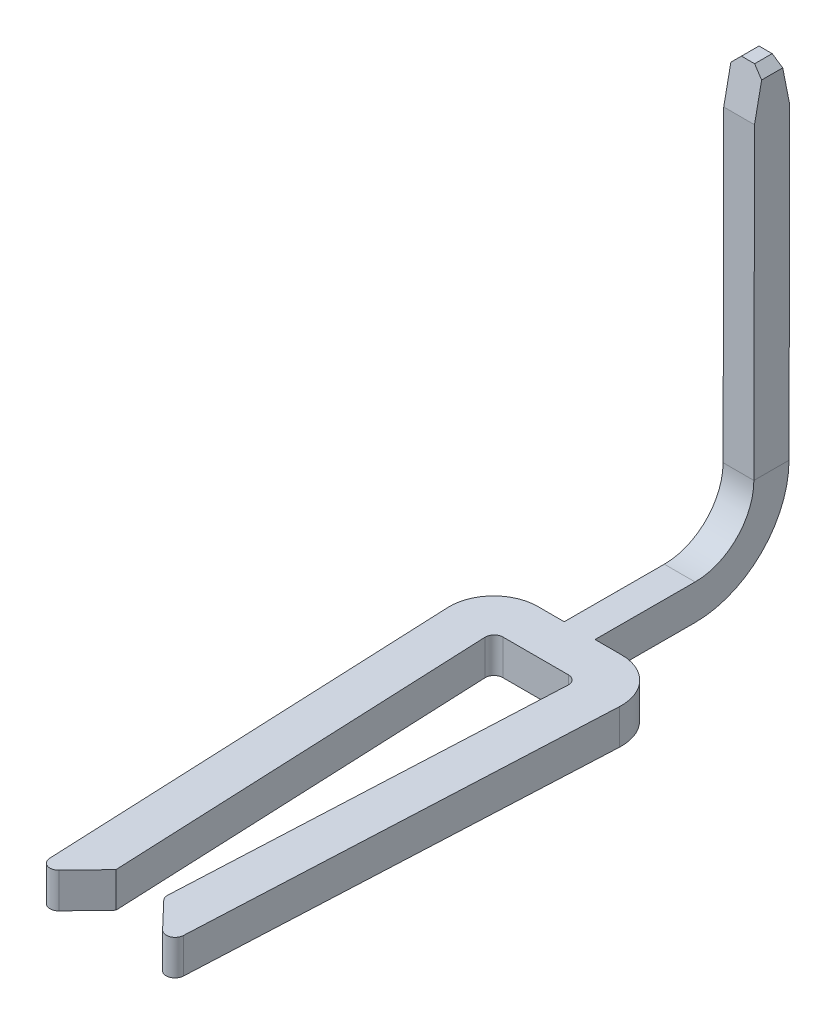
ISO-10303-21;
HEADER;
FILE_DESCRIPTION(('STEP AP214'),'2;1');
FILE_NAME('part.step','',(''),(''),'','','');
FILE_SCHEMA(('AUTOMOTIVE_DESIGN { 1 0 10303 214 1 1 1 1 }'));
ENDSEC;
DATA;
#1=APPLICATION_CONTEXT('core data for automotive mechanical design processes');
#2=APPLICATION_PROTOCOL_DEFINITION('international standard','automotive_design',2000,#1);
#3=PRODUCT_CONTEXT('',#1,'mechanical');
#4=PRODUCT('Part','Part','',(#3));
#5=PRODUCT_RELATED_PRODUCT_CATEGORY('part','',(#4));
#6=PRODUCT_DEFINITION_FORMATION('','',#4);
#7=PRODUCT_DEFINITION_CONTEXT('part definition',#1,'design');
#8=PRODUCT_DEFINITION('design','',#6,#7);
#9=PRODUCT_DEFINITION_SHAPE('','',#8);
#10=(LENGTH_UNIT() NAMED_UNIT(*) SI_UNIT(.MILLI.,.METRE.));
#11=(NAMED_UNIT(*) PLANE_ANGLE_UNIT() SI_UNIT($,.RADIAN.));
#12=(NAMED_UNIT(*) SI_UNIT($,.STERADIAN.) SOLID_ANGLE_UNIT());
#13=UNCERTAINTY_MEASURE_WITH_UNIT(LENGTH_MEASURE(1.E-05),#10,'distance_accuracy_value','');
#14=(GEOMETRIC_REPRESENTATION_CONTEXT(3) GLOBAL_UNCERTAINTY_ASSIGNED_CONTEXT((#13)) GLOBAL_UNIT_ASSIGNED_CONTEXT((#10,
#11,#12)) REPRESENTATION_CONTEXT('',''));
#15=CARTESIAN_POINT('',(0.,0.,0.));
#16=DIRECTION('',(0.,0.,1.));
#17=DIRECTION('',(1.,0.,0.));
#18=AXIS2_PLACEMENT_3D('',#15,#16,#17);
#19=CARTESIAN_POINT('',(-1.463462188596E-05,4.865130922687,-1.715381004673));
#20=DIRECTION('',(-3.25642428491655E-06,0.999997785371169,-0.00210457647840936));
#21=DIRECTION('',(0.,0.00210457647842051,0.999997785376471));
#22=AXIS2_PLACEMENT_3D('',#19,#20,#21);
#23=PLANE('',#22);
#24=DIRECTION('',(0.99999999999672,-4.97020864438725E-07,2.5125900913821E-06));
#25=VECTOR('',#24,1.);
#26=CARTESIAN_POINT('',(-1.430829339538E-05,4.86492018301854,-1.81538083899727));
#27=LINE('',#26,#25);
#28=CARTESIAN_POINT('',(-0.0750141137719823,4.86492025919893,-1.81538102752295));
#29=VERTEX_POINT('',#28);
#30=CARTESIAN_POINT('',(0.0749860891615574,4.86492033367762,-1.81538065094792));
#31=VERTEX_POINT('',#30);
#32=EDGE_CURVE('E187',#29,#31,#27,.T.);
#33=ORIENTED_EDGE('',*,*,#32,.F.);
#34=DIRECTION('',(-3.84684707323419E-06,0.00210399290310039,0.999997786597083));
#35=VECTOR('',#34,1.);
#36=CARTESIAN_POINT('',(-0.0750141915805268,4.8649203370068,-1.81538102768701));
#37=LINE('',#36,#35);
#38=CARTESIAN_POINT('',(-0.0750149609494172,4.86534114613673,-1.61538158476463));
#39=VERTEX_POINT('',#38);
#40=EDGE_CURVE('E193',#29,#39,#37,.T.);
#41=ORIENTED_EDGE('',*,*,#40,.T.);
#42=DIRECTION('',(0.999999999992633,7.60721855878868E-07,3.76241672235724E-06));
#43=VECTOR('',#42,1.);
#44=CARTESIAN_POINT('',(-1.496095037655E-05,4.86534122499781,-1.61538119472863));
#45=LINE('',#44,#43);
#46=CARTESIAN_POINT('',(0.0749850053672122,4.86534150321436,-1.61538094948013));
#47=VERTEX_POINT('',#46);
#48=EDGE_CURVE('E228',#39,#47,#45,.T.);
#49=ORIENTED_EDGE('',*,*,#48,.T.);
#50=DIRECTION('',(3.84685069306866E-06,-0.00210516002847208,-0.999997784140773));
#51=VECTOR('',#50,1.);
#52=CARTESIAN_POINT('',(0.0749849223360024,4.86534174179257,-1.61538098215025));
#53=LINE('',#52,#51);
#54=EDGE_CURVE('E207',#47,#31,#53,.T.);
#55=ORIENTED_EDGE('',*,*,#54,.T.);
#56=EDGE_LOOP('',(#33,#41,#49,#55));
#57=FACE_BOUND('',#56,.T.);
#58=ADVANCED_FACE('F17',(#57),#23,.T.);
#59=CARTESIAN_POINT('',(0.07498536537731,4.865131167434,-1.715380760441));
#60=DIRECTION('',(-0.707104478539354,-0.707107522698354,0.00148585765971474));
#61=DIRECTION('',(0.707108303266089,-0.707105259103729,0.));
#62=AXIS2_PLACEMENT_3D('',#59,#60,#61);
#63=PLANE('',#62);
#64=DIRECTION('',(0.70014281484191,-0.699840594134196,0.14150329193041));
#65=VECTOR('',#64,1.);
#66=CARTESIAN_POINT('',(0.07498480562393,4.86534162508,-1.61538098190502));
#67=LINE('',#66,#65);
#68=CARTESIAN_POINT('',(0.174985299424559,4.76538428606289,-1.59517030396589));
#69=VERTEX_POINT('',#68);
#70=EDGE_CURVE('E233',#47,#69,#67,.T.);
#71=ORIENTED_EDGE('',*,*,#70,.T.);
#72=DIRECTION('',(-3.26328490597479E-06,0.00210457646545854,0.999997785371174));
#73=VECTOR('',#72,1.);
#74=CARTESIAN_POINT('',(0.17498608261278,4.764879166049,-1.835169711395));
#75=LINE('',#74,#73);
#76=CARTESIAN_POINT('',(0.174986082612927,4.76487916604903,-1.83516971139521));
#77=VERTEX_POINT('',#76);
#78=EDGE_CURVE('E217',#77,#69,#75,.T.);
#79=ORIENTED_EDGE('',*,*,#78,.F.);
#80=DIRECTION('',(0.700142663372175,-0.700431017500769,-0.138551942061291));
#81=VECTOR('',#80,1.);
#82=CARTESIAN_POINT('',(0.0749856917056828,4.86492074217058,-1.81538053257219));
#83=LINE('',#82,#81);
#84=EDGE_CURVE('E209',#31,#77,#83,.T.);
#85=ORIENTED_EDGE('',*,*,#84,.F.);
#86=ORIENTED_EDGE('',*,*,#54,.F.);
#87=EDGE_LOOP('',(#71,#79,#85,#86));
#88=FACE_BOUND('',#87,.T.);
#89=ADVANCED_FACE('F629',(#88),#63,.F.);
#90=CARTESIAN_POINT('',(0.175007184791,-1.635275026444,-1.901700244763));
#91=DIRECTION('',(0.999999999989374,3.26328490643622E-06,3.25642428496622E-06));
#92=DIRECTION('',(-3.26328490645352E-06,0.999999999994675,0.));
#93=AXIS2_PLACEMENT_3D('',#90,#91,#92);
#94=PLANE('',#93);
#95=ORIENTED_EDGE('',*,*,#78,.T.);
#96=DIRECTION('',(0.,0.980165762670786,-0.198179407830372));
#97=VECTOR('',#96,1.);
#98=CARTESIAN_POINT('',(0.17498529942436,4.86534151346052,-1.61538056771209));
#99=LINE('',#98,#97);
#100=CARTESIAN_POINT('',(0.174985646593566,4.36555335615953,-1.51432856778294));
#101=VERTEX_POINT('',#100);
#102=EDGE_CURVE('E236',#69,#101,#99,.F.);
#103=ORIENTED_EDGE('',*,*,#102,.T.);
#104=DIRECTION('',(-3.49443103478557E-06,0.999997785370364,-0.00210457647918396));
#105=VECTOR('',#104,1.);
#106=CARTESIAN_POINT('',(0.174998571439184,0.865561512268137,-1.5069625723225));
#107=LINE('',#106,#105);
#108=CARTESIAN_POINT('',(0.174999960433436,0.865561368804181,-1.50696257201619));
#109=VERTEX_POINT('',#108);
#110=EDGE_CURVE('E237',#109,#101,#107,.T.);
#111=ORIENTED_EDGE('',*,*,#110,.F.);
#112=DIRECTION('',(3.26328805578984E-06,-0.00210554377478037,-0.999997783334925));
#113=VECTOR('',#112,1.);
#114=CARTESIAN_POINT('',(0.174997738416343,0.865561511739281,-1.50696282232171));
#115=LINE('',#114,#113);
#116=CARTESIAN_POINT('',(0.175001265747852,0.864719102488243,-1.90696168524787));
#117=VERTEX_POINT('',#116);
#118=EDGE_CURVE('E220',#109,#117,#115,.T.);
#119=ORIENTED_EDGE('',*,*,#118,.T.);
#120=DIRECTION('',(-3.9389050821038E-06,0.999997785368709,-0.00210457648063097));
#121=VECTOR('',#120,1.);
#122=CARTESIAN_POINT('',(0.175001265746,0.864719294762998,-1.90696168565267));
#123=LINE('',#122,#121);
#124=CARTESIAN_POINT('',(0.174987013925,4.36471084672889,-1.9143277563463));
#125=VERTEX_POINT('',#124);
#126=EDGE_CURVE('E331',#117,#125,#123,.T.);
#127=ORIENTED_EDGE('',*,*,#126,.T.);
#128=DIRECTION('',(0.,0.980991245476944,0.194051993799582));
#129=VECTOR('',#128,1.);
#130=CARTESIAN_POINT('',(0.174986082613,4.86492037806116,-1.81538034350575));
#131=LINE('',#130,#129);
#132=EDGE_CURVE('E204',#77,#125,#131,.F.);
#133=ORIENTED_EDGE('',*,*,#132,.F.);
#134=EDGE_LOOP('',(#95,#103,#111,#119,#127,#133));
#135=FACE_BOUND('',#134,.T.);
#136=ADVANCED_FACE('F362',(#135),#94,.T.);
#137=CARTESIAN_POINT('',(-0.660699790075,-6.89625102089,-1.490629935269));
#138=DIRECTION('',(-3.26328490585055E-06,0.00210457646778236,0.999997785371169));
#139=DIRECTION('',(0.,-0.999997785376493,0.00210457646779356));
#140=AXIS2_PLACEMENT_3D('',#137,#138,#139);
#141=PLANE('',#140);
#142=DIRECTION('',(0.999999999994675,6.867832620559E-09,3.26327767890309E-06));
#143=VECTOR('',#142,1.);
#144=CARTESIAN_POINT('',(-0.660699790075,0.865560932680311,-1.5069652982306));
#145=LINE('',#144,#143);
#146=CARTESIAN_POINT('',(-0.175002261582777,0.865560938618676,-1.5069637132704));
#147=VERTEX_POINT('',#146);
#148=EDGE_CURVE('E219',#147,#109,#145,.T.);
#149=ORIENTED_EDGE('',*,*,#148,.T.);
#150=ORIENTED_EDGE('',*,*,#110,.T.);
#151=DIRECTION('',(0.999999999992633,7.60721855878868E-07,3.76241672235724E-06));
#152=VECTOR('',#151,1.);
#153=CARTESIAN_POINT('',(-1.496095037655E-05,4.36555322305428,-1.51432921552461));
#154=LINE('',#153,#152);
#155=CARTESIAN_POINT('',(-0.175016815444694,4.36555261278008,-1.51432977748102));
#156=VERTEX_POINT('',#155);
#157=EDGE_CURVE('E230',#101,#156,#154,.F.);
#158=ORIENTED_EDGE('',*,*,#157,.T.);
#159=DIRECTION('',(-4.1582472281534E-06,0.999997785367819,-0.00210457648149677));
#160=VECTOR('',#159,1.);
#161=CARTESIAN_POINT('',(-0.175002261582766,0.865560936016,-1.506963713265));
#162=LINE('',#161,#160);
#163=EDGE_CURVE('E323',#147,#156,#162,.T.);
#164=ORIENTED_EDGE('',*,*,#163,.F.);
#165=EDGE_LOOP('',(#149,#150,#158,#164));
#166=FACE_BOUND('',#165,.T.);
#167=ADVANCED_FACE('F635',(#166),#141,.T.);
#168=CARTESIAN_POINT('',(-1.496095037655E-05,4.865341380334,-1.615381226136));
#169=DIRECTION('',(3.8385514630763E-06,-0.198179407828912,-0.980165762663565));
#170=DIRECTION('',(0.,0.980165762670786,-0.198179407830372));
#171=AXIS2_PLACEMENT_3D('',#168,#169,#170);
#172=PLANE('',#171);
#173=DIRECTION('',(-0.700138103468634,-0.699845958596594,0.141500071757432));
#174=VECTOR('',#173,1.);
#175=CARTESIAN_POINT('',(-0.075014960949294,4.86534113523326,-1.615381638692));
#176=LINE('',#175,#174);
#177=CARTESIAN_POINT('',(-0.175017620001244,4.76538254779124,-1.59517126651604));
#178=VERTEX_POINT('',#177);
#179=EDGE_CURVE('E197',#39,#178,#176,.T.);
#180=ORIENTED_EDGE('',*,*,#179,.T.);
#181=DIRECTION('',(-3.43751459112234E-06,0.980165762662443,-0.19817940784182));
#182=VECTOR('',#181,1.);
#183=CARTESIAN_POINT('',(-0.175016815444694,4.36555237420685,-1.51432972924427));
#184=LINE('',#183,#182);
#185=EDGE_CURVE('E165',#156,#178,#184,.T.);
#186=ORIENTED_EDGE('',*,*,#185,.F.);
#187=ORIENTED_EDGE('',*,*,#157,.F.);
#188=ORIENTED_EDGE('',*,*,#102,.F.);
#189=ORIENTED_EDGE('',*,*,#70,.F.);
#190=ORIENTED_EDGE('',*,*,#48,.F.);
#191=EDGE_LOOP('',(#180,#186,#187,#188,#189,#190));
#192=FACE_BOUND('',#191,.T.);
#193=ADVANCED_FACE('F628',(#192),#172,.F.);
#194=CARTESIAN_POINT('',(-0.07501463462109,4.865130677941,-1.715381248905));
#195=DIRECTION('',(0.707109083818663,-0.707102907716663,0.00149046293910229));
#196=DIRECTION('',(0.707103693125374,0.707109869234235,0.));
#197=AXIS2_PLACEMENT_3D('',#194,#195,#196);
#198=PLANE('',#197);
#199=DIRECTION('',(0.700138254945022,0.700434562183973,0.138556299245773));
#200=VECTOR('',#199,1.);
#201=CARTESIAN_POINT('',(-0.175013917383573,4.76487805659896,-1.83517084467532));
#202=LINE('',#201,#200);
#203=CARTESIAN_POINT('',(-0.175017434485298,4.76487627304445,-1.8351710700712));
#204=VERTEX_POINT('',#203);
#205=EDGE_CURVE('E195',#204,#29,#202,.T.);
#206=ORIENTED_EDGE('',*,*,#205,.F.);
#207=DIRECTION('',(3.26328216226373E-06,-0.00210457646545854,-0.999997785371174));
#208=VECTOR('',#207,1.);
#209=CARTESIAN_POINT('',(-0.175018217681012,4.76538312223635,-1.59517138266645));
#210=LINE('',#209,#208);
#211=EDGE_CURVE('E159',#178,#204,#210,.T.);
#212=ORIENTED_EDGE('',*,*,#211,.F.);
#213=ORIENTED_EDGE('',*,*,#179,.F.);
#214=ORIENTED_EDGE('',*,*,#40,.F.);
#215=EDGE_LOOP('',(#206,#212,#213,#214));
#216=FACE_BOUND('',#215,.T.);
#217=ADVANCED_FACE('F194',(#216),#198,.F.);
#218=CARTESIAN_POINT('',(-1.430829339538E-05,4.86492046504,-1.81538078321));
#219=DIRECTION('',(2.56127677282229E-06,0.194051993798946,-0.980991245473727));
#220=DIRECTION('',(0.,0.980991245476944,0.194051993799582));
#221=AXIS2_PLACEMENT_3D('',#218,#219,#220);
#222=PLANE('',#221);
#223=DIRECTION('',(-4.71748013645017E-06,0.980991166183589,0.194052394593592));
#224=VECTOR('',#223,1.);
#225=CARTESIAN_POINT('',(-0.175015510131829,4.36471054361986,-1.91432884339227));
#226=LINE('',#225,#224);
#227=CARTESIAN_POINT('',(-0.175015510132432,4.36471068858205,-1.9143288436974));
#228=VERTEX_POINT('',#227);
#229=EDGE_CURVE('E20',#204,#228,#226,.F.);
#230=ORIENTED_EDGE('',*,*,#229,.F.);
#231=ORIENTED_EDGE('',*,*,#205,.T.);
#232=ORIENTED_EDGE('',*,*,#32,.T.);
#233=ORIENTED_EDGE('',*,*,#84,.T.);
#234=ORIENTED_EDGE('',*,*,#132,.T.);
#235=DIRECTION('',(0.999999999994675,6.867832620559E-09,3.26327767890309E-06));
#236=VECTOR('',#235,1.);
#237=CARTESIAN_POINT('',(-0.660698484761,4.36471083020865,-1.91433042892102));
#238=LINE('',#237,#236);
#239=EDGE_CURVE('E329',#125,#228,#238,.F.);
#240=ORIENTED_EDGE('',*,*,#239,.T.);
#241=EDGE_LOOP('',(#230,#231,#232,#233,#234,#240));
#242=FACE_BOUND('',#241,.T.);
#243=ADVANCED_FACE('F201',(#242),#222,.T.);
#244=CARTESIAN_POINT('',(-0.660698484761,-6.897092851477,-1.890629049418));
#245=DIRECTION('',(-3.26328490585055E-06,0.00210457646778236,0.999997785371169));
#246=DIRECTION('',(0.,-0.999997785376493,0.00210457646779356));
#247=AXIS2_PLACEMENT_3D('',#244,#245,#246);
#248=PLANE('',#247);
#249=ORIENTED_EDGE('',*,*,#126,.F.);
#250=DIRECTION('',(0.999999999994675,6.867832620559E-09,3.26327767890309E-06));
#251=VECTOR('',#250,1.);
#252=CARTESIAN_POINT('',(-0.660698484761,0.864718904481308,-1.90696441196371));
#253=LINE('',#252,#251);
#254=CARTESIAN_POINT('',(-0.175000956269501,0.864719009225572,-1.90696282721062));
#255=VERTEX_POINT('',#254);
#256=EDGE_CURVE('E203',#255,#117,#253,.T.);
#257=ORIENTED_EDGE('',*,*,#256,.F.);
#258=DIRECTION('',(4.15824722815211E-06,-0.999997785367819,0.0021045764815281));
#259=VECTOR('',#258,1.);
#260=CARTESIAN_POINT('',(-0.175015510131829,4.36471054361985,-1.91432884339227));
#261=LINE('',#260,#259);
#262=EDGE_CURVE('E311',#228,#255,#261,.T.);
#263=ORIENTED_EDGE('',*,*,#262,.F.);
#264=ORIENTED_EDGE('',*,*,#239,.F.);
#265=EDGE_LOOP('',(#249,#257,#263,#264));
#266=FACE_BOUND('',#265,.T.);
#267=ADVANCED_FACE('F374',(#266),#248,.F.);
#268=CARTESIAN_POINT('',(-0.175000956267,0.864718407818,-1.906962825945));
#269=DIRECTION('',(-0.99999999998603,-4.16510584607213E-06,-3.2545235860591E-06));
#270=DIRECTION('',(4.16510584609418E-06,-0.999999999991326,0.));
#271=AXIS2_PLACEMENT_3D('',#268,#269,#270);
#272=PLANE('',#271);
#273=ORIENTED_EDGE('',*,*,#229,.T.);
#274=ORIENTED_EDGE('',*,*,#262,.T.);
#275=CARTESIAN_POINT('',(-0.175004438076532,0.866964619264,-0.840000571091002));
#276=DIRECTION('',(-0.99999999998603,-4.16510584607213E-06,-3.2545235860591E-06));
#277=DIRECTION('',(4.16510584609418E-06,-0.999999999991326,0.));
#278=AXIS2_PLACEMENT_3D('',#275,#276,#277);
#279=CIRCLE('',#278,1.066964619264);
#280=CARTESIAN_POINT('',(-0.175001112382431,-0.199997636538759,-0.837754812458445));
#281=VERTEX_POINT('',#280);
#282=EDGE_CURVE('E309',#281,#255,#279,.F.);
#283=ORIENTED_EDGE('',*,*,#282,.F.);
#284=DIRECTION('',(-4.15824723002358E-06,0.999997785369037,-0.00210457590274754));
#285=VECTOR('',#284,1.);
#286=CARTESIAN_POINT('',(-0.175000001375724,-0.199997635864746,-0.837754491631768));
#287=LINE('',#286,#285);
#288=CARTESIAN_POINT('',(-0.175000831649492,0.200001291003723,-0.838596215389816));
#289=VERTEX_POINT('',#288);
#290=EDGE_CURVE('E325',#281,#289,#287,.T.);
#291=ORIENTED_EDGE('',*,*,#290,.T.);
#292=CARTESIAN_POINT('',(-0.175004438076532,0.866964619264,-0.840000571091002));
#293=DIRECTION('',(-0.99999999998603,-4.16510584607213E-06,-3.2545235860591E-06));
#294=DIRECTION('',(4.16510584609418E-06,-0.999999999991326,0.));
#295=AXIS2_PLACEMENT_3D('',#292,#293,#294);
#296=CIRCLE('',#295,0.666964619264);
#297=EDGE_CURVE('E306',#289,#147,#296,.F.);
#298=ORIENTED_EDGE('',*,*,#297,.T.);
#299=ORIENTED_EDGE('',*,*,#163,.T.);
#300=ORIENTED_EDGE('',*,*,#185,.T.);
#301=ORIENTED_EDGE('',*,*,#211,.T.);
#302=EDGE_LOOP('',(#273,#274,#283,#291,#298,#299,#300,#301));
#303=FACE_BOUND('',#302,.T.);
#304=ADVANCED_FACE('F378',(#303),#272,.T.);
#305=CARTESIAN_POINT('',(-0.175004437551,0.866964619264,-0.840000571091));
#306=DIRECTION('',(0.999999999994676,0.,3.26329213278794E-06));
#307=DIRECTION('',(3.26329213278794E-06,0.,-0.999999999994676));
#308=AXIS2_PLACEMENT_3D('',#305,#306,#307);
#309=CYLINDRICAL_SURFACE('',#308,1.066964619264);
#310=CARTESIAN_POINT('',(0.175000005953661,0.866964619264,-0.839999428924253));
#311=DIRECTION('',(0.999999999999593,-8.76572615124842E-09,-9.01817128790833E-07));
#312=DIRECTION('',(-9.01817128790833E-07,0.,-0.999999999999594));
#313=AXIS2_PLACEMENT_3D('',#310,#311,#312);
#314=CIRCLE('',#313,1.066964619264);
#315=CARTESIAN_POINT('',(0.1750000819635,-0.199997636548618,-0.837753670295029));
#316=VERTEX_POINT('',#315);
#317=EDGE_CURVE('E283',#316,#117,#314,.T.);
#318=ORIENTED_EDGE('',*,*,#317,.F.);
#319=DIRECTION('',(0.999999999994676,0.,3.26329213278794E-06));
#320=VECTOR('',#319,1.);
#321=CARTESIAN_POINT('',(-0.175004444880382,-0.199997636022669,-0.837754562462747));
#322=LINE('',#321,#320);
#323=EDGE_CURVE('E308',#316,#281,#322,.F.);
#324=ORIENTED_EDGE('',*,*,#323,.T.);
#325=ORIENTED_EDGE('',*,*,#282,.T.);
#326=ORIENTED_EDGE('',*,*,#256,.T.);
#327=EDGE_LOOP('',(#318,#324,#325,#326));
#328=FACE_BOUND('',#327,.T.);
#329=ADVANCED_FACE('F375',(#328),#309,.T.);
#330=CARTESIAN_POINT('',(-0.175004437551,0.866964619264,-0.840000571091));
#331=DIRECTION('',(0.999999999994676,0.,3.26329213278794E-06));
#332=DIRECTION('',(3.26329213278794E-06,0.,-0.999999999994676));
#333=AXIS2_PLACEMENT_3D('',#330,#331,#332);
#334=CYLINDRICAL_SURFACE('',#333,0.666964619264);
#335=DIRECTION('',(1.,-6.86783262048414E-09,1.44539109276665E-11));
#336=VECTOR('',#335,1.);
#337=CARTESIAN_POINT('',(-0.660722802882,0.200001482953957,-0.838595685024081));
#338=LINE('',#337,#336);
#339=CARTESIAN_POINT('',(0.175000001373135,0.200001477144774,-0.838595717946777));
#340=VERTEX_POINT('',#339);
#341=EDGE_CURVE('E305',#340,#289,#338,.F.);
#342=ORIENTED_EDGE('',*,*,#341,.F.);
#343=CARTESIAN_POINT('',(0.175000005953661,0.866964619264,-0.839999428924253));
#344=DIRECTION('',(0.999999999999593,-8.76572615124842E-09,-9.01817128790833E-07));
#345=DIRECTION('',(-9.01817128790833E-07,0.,-0.999999999999594));
#346=AXIS2_PLACEMENT_3D('',#343,#344,#345);
#347=CIRCLE('',#346,0.666964619264);
#348=EDGE_CURVE('E280',#109,#340,#347,.F.);
#349=ORIENTED_EDGE('',*,*,#348,.F.);
#350=ORIENTED_EDGE('',*,*,#148,.F.);
#351=ORIENTED_EDGE('',*,*,#297,.F.);
#352=EDGE_LOOP('',(#342,#349,#350,#351));
#353=FACE_BOUND('',#352,.T.);
#354=ADVANCED_FACE('F377',(#353),#334,.F.);
#355=CARTESIAN_POINT('',(-0.660722802882,0.213470775545,5.561391660584));
#356=DIRECTION('',(6.86784783018139E-09,0.999997785376493,-0.00210457646777604));
#357=DIRECTION('',(0.,0.00210457646777604,0.999997785376493));
#358=AXIS2_PLACEMENT_3D('',#355,#356,#357);
#359=PLANE('',#358);
#360=DIRECTION('',(-0.690866245713119,0.00152157689847403,0.722980992376703));
#361=VECTOR('',#360,1.);
#362=CARTESIAN_POINT('',(-0.272211008901727,0.212919738458001,5.29956548953126));
#363=LINE('',#362,#361);
#364=CARTESIAN_POINT('',(-0.272211008901909,0.212919738458,5.29956548953109));
#365=VERTEX_POINT('',#364);
#366=CARTESIAN_POINT('',(-0.588424543538575,0.213616173132981,5.63047813216401));
#367=VERTEX_POINT('',#366);
#368=EDGE_CURVE('E273',#365,#367,#363,.T.);
#369=ORIENTED_EDGE('',*,*,#368,.F.);
#370=DIRECTION('',(-0.0454076609344932,-0.00210240536982446,-0.998966327871024));
#371=VECTOR('',#370,1.);
#372=CARTESIAN_POINT('',(-0.272211008902,0.212919738458,5.299565489531));
#373=LINE('',#372,#371);
#374=CARTESIAN_POINT('',(-0.47200460483291,0.20366916002481,0.904116114866381));
#375=VERTEX_POINT('',#374);
#376=EDGE_CURVE('E474',#365,#375,#373,.T.);
#377=ORIENTED_EDGE('',*,*,#376,.T.);
#378=CARTESIAN_POINT('',(-0.372107756489,0.203659602686469,0.899575233959999));
#379=DIRECTION('',(6.86784783018139E-09,0.999997785376493,-0.00210457646777604));
#380=DIRECTION('',(0.,0.00210457646777604,0.999997785376493));
#381=AXIS2_PLACEMENT_3D('',#378,#379,#380);
#382=CIRCLE('',#381,0.09999999999845);
#383=CARTESIAN_POINT('',(-0.372107756490584,0.203449145039347,0.799575455423793));
#384=VERTEX_POINT('',#383);
#385=EDGE_CURVE('E303',#375,#384,#382,.F.);
#386=ORIENTED_EDGE('',*,*,#385,.T.);
#387=DIRECTION('',(1.,0.,-7.22694751364327E-12));
#388=VECTOR('',#387,1.);
#389=CARTESIAN_POINT('',(-0.476756463515,0.203449145039001,0.799575455424513));
#390=LINE('',#389,#388);
#391=CARTESIAN_POINT('',(0.372107634189486,0.203449142483482,0.799575455418398));
#392=VERTEX_POINT('',#391);
#393=EDGE_CURVE('E302',#384,#392,#390,.T.);
#394=ORIENTED_EDGE('',*,*,#393,.T.);
#395=CARTESIAN_POINT('',(0.372107759191,0.203659597574772,0.899575233965));
#396=DIRECTION('',(6.86784783018139E-09,0.999997785376493,-0.00210457646777604));
#397=DIRECTION('',(0.,0.00210457646777604,0.999997785376493));
#398=AXIS2_PLACEMENT_3D('',#395,#396,#397);
#399=CIRCLE('',#398,0.09999999999845);
#400=CARTESIAN_POINT('',(0.472004613210557,0.203669153278078,0.904115990000817));
#401=VERTEX_POINT('',#400);
#402=EDGE_CURVE('E299',#392,#401,#399,.F.);
#403=ORIENTED_EDGE('',*,*,#402,.T.);
#404=DIRECTION('',(-0.0454076609032243,0.00210240599378526,0.998966327871133));
#405=VECTOR('',#404,1.);
#406=CARTESIAN_POINT('',(0.472004613210548,0.203669153278,0.904115990001025));
#407=LINE('',#406,#405);
#408=CARTESIAN_POINT('',(0.274152572322218,0.21282983912638,5.25685125134316));
#409=VERTEX_POINT('',#408);
#410=EDGE_CURVE('E298',#401,#409,#407,.T.);
#411=ORIENTED_EDGE('',*,*,#410,.T.);
#412=CARTESIAN_POINT('',(0.374049411904139,0.212839395498145,5.26139232499489));
#413=DIRECTION('',(6.86784783018139E-09,0.999997785376493,-0.00210457646777604));
#414=DIRECTION('',(0.,0.00210457646777604,0.999997785376493));
#415=AXIS2_PLACEMENT_3D('',#412,#413,#414);
#416=CIRCLE('',#415,0.09999999999845);
#417=CARTESIAN_POINT('',(0.301751152558919,0.212984794079,5.33047879656981));
#418=VERTEX_POINT('',#417);
#419=EDGE_CURVE('E295',#418,#409,#416,.F.);
#420=ORIENTED_EDGE('',*,*,#419,.F.);
#421=DIRECTION('',(-0.690866245774943,-0.00152156740611231,-0.722980992337603));
#422=VECTOR('',#421,1.);
#423=CARTESIAN_POINT('',(0.588424358527808,0.213616164636,5.63047793561518));
#424=LINE('',#423,#422);
#425=CARTESIAN_POINT('',(0.588424452450644,0.213616164843221,5.63047803390358));
#426=VERTEX_POINT('',#425);
#427=EDGE_CURVE('E530',#426,#418,#424,.T.);
#428=ORIENTED_EDGE('',*,*,#427,.F.);
#429=CARTESIAN_POINT('',(0.660722805719139,0.21347076646956,5.56139166061689));
#430=DIRECTION('',(6.86784783018139E-09,0.999997785376493,-0.00210457646777604));
#431=DIRECTION('',(0.,0.00210457646777604,0.999997785376493));
#432=AXIS2_PLACEMENT_3D('',#429,#430,#431);
#433=CIRCLE('',#432,0.09999999999964);
#434=CARTESIAN_POINT('',(0.76061965973958,0.213480322172973,5.5659324166662));
#435=VERTEX_POINT('',#434);
#436=EDGE_CURVE('E291',#435,#426,#433,.F.);
#437=ORIENTED_EDGE('',*,*,#436,.F.);
#438=DIRECTION('',(-0.0454076609115571,0.00210240599372779,0.998966327870754));
#439=VECTOR('',#438,1.);
#440=CARTESIAN_POINT('',(0.976240720663177,0.203496918453,0.822279581036008));
#441=LINE('',#440,#439);
#442=CARTESIAN_POINT('',(0.976240728513844,0.203496918089409,0.822279408319732));
#443=VERTEX_POINT('',#442);
#444=EDGE_CURVE('E293',#443,#435,#441,.T.);
#445=ORIENTED_EDGE('',*,*,#444,.F.);
#446=CARTESIAN_POINT('',(0.476756466259139,0.203449139208887,0.799575455420891));
#447=DIRECTION('',(6.86784783018139E-09,0.999997785376493,-0.00210457646777604));
#448=DIRECTION('',(0.,0.00210457646777604,0.999997785376493));
#449=AXIS2_PLACEMENT_3D('',#446,#447,#448);
#450=CIRCLE('',#449,0.5);
#451=CARTESIAN_POINT('',(0.476756466381,0.202396852011497,0.299576562730695));
#452=VERTEX_POINT('',#451);
#453=EDGE_CURVE('E287',#452,#443,#450,.F.);
#454=ORIENTED_EDGE('',*,*,#453,.F.);
#455=DIRECTION('',(1.,0.,-7.22806456795341E-12));
#456=VECTOR('',#455,1.);
#457=CARTESIAN_POINT('',(0.999999998635,0.202396853047987,0.299576562724964));
#458=LINE('',#457,#456);
#459=CARTESIAN_POINT('',(0.175001027817391,0.202396853047995,0.299576562730459));
#460=VERTEX_POINT('',#459);
#461=EDGE_CURVE('E523',#460,#452,#458,.T.);
#462=ORIENTED_EDGE('',*,*,#461,.F.);
#463=DIRECTION('',(9.01833579741016E-07,0.00210457646800604,0.999997785376086));
#464=VECTOR('',#463,1.);
#465=CARTESIAN_POINT('',(0.175000001373165,0.200001477214,-0.838595685012));
#466=LINE('',#465,#464);
#467=EDGE_CURVE('E282',#340,#460,#466,.T.);
#468=ORIENTED_EDGE('',*,*,#467,.F.);
#469=ORIENTED_EDGE('',*,*,#341,.T.);
#470=DIRECTION('',(-7.22867183483043E-12,-0.00210479611450715,-0.999997784914205));
#471=VECTOR('',#470,1.);
#472=CARTESIAN_POINT('',(-0.174999998618566,0.202396855101,0.299576396062));
#473=LINE('',#472,#471);
#474=CARTESIAN_POINT('',(-0.174999998618189,0.202396856833263,0.299576562724982));
#475=VERTEX_POINT('',#474);
#476=EDGE_CURVE('E519',#475,#289,#473,.T.);
#477=ORIENTED_EDGE('',*,*,#476,.F.);
#478=DIRECTION('',(1.,0.,-7.22694751364327E-12));
#479=VECTOR('',#478,1.);
#480=CARTESIAN_POINT('',(-0.175000001365,0.202396857523995,0.299576562723528));
#481=LINE('',#480,#479);
#482=CARTESIAN_POINT('',(-0.4767561669705,0.202396857523838,0.299576562725736));
#483=VERTEX_POINT('',#482);
#484=EDGE_CURVE('E502',#483,#475,#481,.T.);
#485=ORIENTED_EDGE('',*,*,#484,.F.);
#486=CARTESIAN_POINT('',(-0.476756463488861,0.203449145757566,0.79957545541389));
#487=DIRECTION('',(6.86784783018139E-09,0.999997785376493,-0.00210457646777604));
#488=DIRECTION('',(0.,0.00210457646777604,0.999997785376493));
#489=AXIS2_PLACEMENT_3D('',#486,#487,#488);
#490=CIRCLE('',#489,0.5);
#491=CARTESIAN_POINT('',(-0.976240733596348,0.203496931135131,0.822279235527081));
#492=VERTEX_POINT('',#491);
#493=EDGE_CURVE('E275',#492,#483,#490,.F.);
#494=ORIENTED_EDGE('',*,*,#493,.F.);
#495=DIRECTION('',(-0.045407660925871,-0.00210240537006368,-0.998966327871416));
#496=VECTOR('',#495,1.);
#497=CARTESIAN_POINT('',(-0.760619669248062,0.213480332049,5.565932145001));
#498=LINE('',#497,#496);
#499=CARTESIAN_POINT('',(-0.760619663074998,0.213480332334881,5.56593228080995));
#500=VERTEX_POINT('',#499);
#501=EDGE_CURVE('E278',#500,#492,#498,.T.);
#502=ORIENTED_EDGE('',*,*,#501,.F.);
#503=CARTESIAN_POINT('',(-0.660722802881861,0.213470775545185,5.56139166058389));
#504=DIRECTION('',(6.86784783018139E-09,0.999997785376493,-0.00210457646777604));
#505=DIRECTION('',(0.,0.00210457646777604,0.999997785376493));
#506=AXIS2_PLACEMENT_3D('',#503,#504,#505);
#507=CIRCLE('',#506,0.09999999999961);
#508=EDGE_CURVE('E271',#367,#500,#507,.F.);
#509=ORIENTED_EDGE('',*,*,#508,.F.);
#510=EDGE_LOOP('',(#369,#377,#386,#394,#403,#411,#420,#428,#437,#445,#454,#462,#468,#469,#477,
#485,#494,#502,#509));
#511=FACE_BOUND('',#510,.T.);
#512=ADVANCED_FACE('F385',(#511),#359,.T.);
#513=CARTESIAN_POINT('',(-0.476756463515,0.203449145758,0.799575455423));
#514=DIRECTION('',(-7.22696351864656E-12,-0.00210457646777604,-0.999997785376493));
#515=DIRECTION('',(0.,0.999997785376493,-0.00210457646777604));
#516=AXIS2_PLACEMENT_3D('',#513,#514,#515);
#517=PLANE('',#516);
#518=DIRECTION('',(6.86784783018139E-09,0.999997785376493,-0.00210457646777604));
#519=VECTOR('',#518,1.);
#520=CARTESIAN_POINT('',(0.372107509190139,0.203449139928228,0.799575455429213));
#521=LINE('',#520,#519);
#522=CARTESIAN_POINT('',(0.37210763144343,-0.196549974222428,0.800417286020398));
#523=VERTEX_POINT('',#522);
#524=EDGE_CURVE('E301',#523,#392,#521,.T.);
#525=ORIENTED_EDGE('',*,*,#524,.T.);
#526=ORIENTED_EDGE('',*,*,#393,.F.);
#527=DIRECTION('',(6.86784783018139E-09,0.999997785376493,-0.00210457646777604));
#528=VECTOR('',#527,1.);
#529=CARTESIAN_POINT('',(-0.37210775649,0.203449145039226,0.799575455423901));
#530=LINE('',#529,#528);
#531=CARTESIAN_POINT('',(-0.372107759236639,-0.196549969111279,0.800417286011002));
#532=VERTEX_POINT('',#531);
#533=EDGE_CURVE('E484',#384,#532,#530,.F.);
#534=ORIENTED_EDGE('',*,*,#533,.T.);
#535=DIRECTION('',(1.,-6.86783262048414E-09,1.44539109276665E-11));
#536=VECTOR('',#535,1.);
#537=CARTESIAN_POINT('',(-0.660722805629,-0.196549967129397,0.800417286006829));
#538=LINE('',#537,#536);
#539=EDGE_CURVE('E270',#532,#523,#538,.T.);
#540=ORIENTED_EDGE('',*,*,#539,.T.);
#541=EDGE_LOOP('',(#525,#526,#534,#540));
#542=FACE_BOUND('',#541,.T.);
#543=ADVANCED_FACE('F461',(#542),#517,.F.);
#544=CARTESIAN_POINT('',(0.372107759191,0.203659597575,0.899575233965));
#545=DIRECTION('',(6.86784783018139E-09,0.999997785376493,-0.00210457646777604));
#546=DIRECTION('',(0.,0.00210457646777604,0.999997785376493));
#547=AXIS2_PLACEMENT_3D('',#544,#545,#546);
#548=CYLINDRICAL_SURFACE('',#547,0.09999999999845);
#549=CARTESIAN_POINT('',(0.372107756443861,-0.196339516575385,0.90041706455211));
#550=DIRECTION('',(6.86784783018139E-09,0.999997785376493,-0.00210457646777604));
#551=DIRECTION('',(0.,0.00210457646777604,0.999997785376493));
#552=AXIS2_PLACEMENT_3D('',#549,#550,#551);
#553=CIRCLE('',#552,0.09999999999845);
#554=CARTESIAN_POINT('',(0.47200461046311,-0.196329960872279,0.904957820587855));
#555=VERTEX_POINT('',#554);
#556=EDGE_CURVE('E267',#523,#555,#553,.F.);
#557=ORIENTED_EDGE('',*,*,#556,.T.);
#558=DIRECTION('',(6.8678347514317E-09,0.999997785376494,-0.00210457646748828));
#559=VECTOR('',#558,1.);
#560=CARTESIAN_POINT('',(0.472004610463414,-0.196329960872,0.904957820588019));
#561=LINE('',#560,#559);
#562=EDGE_CURVE('E532',#555,#401,#561,.T.);
#563=ORIENTED_EDGE('',*,*,#562,.T.);
#564=ORIENTED_EDGE('',*,*,#402,.F.);
#565=ORIENTED_EDGE('',*,*,#524,.F.);
#566=EDGE_LOOP('',(#557,#563,#564,#565));
#567=FACE_BOUND('',#566,.T.);
#568=ADVANCED_FACE('F457',(#567),#548,.F.);
#569=CARTESIAN_POINT('',(0.476756466213,0.203449139209,0.79957545543));
#570=DIRECTION('',(0.998968540211001,9.55570338448901E-05,0.04540756035679));
#571=DIRECTION('',(0.0454075605641016,0.,-0.998968544771865));
#572=AXIS2_PLACEMENT_3D('',#569,#570,#571);
#573=PLANE('',#572);
#574=DIRECTION('',(6.86784783018139E-09,0.999997785376493,-0.00210457646777604));
#575=VECTOR('',#574,1.);
#576=CARTESIAN_POINT('',(0.274152584013727,-0.187169275693282,5.2576927643142));
#577=LINE('',#576,#575);
#578=CARTESIAN_POINT('',(0.274152569575411,-0.187169275024848,5.25769308193029));
#579=VERTEX_POINT('',#578);
#580=EDGE_CURVE('E297',#409,#579,#577,.F.);
#581=ORIENTED_EDGE('',*,*,#580,.F.);
#582=ORIENTED_EDGE('',*,*,#410,.F.);
#583=ORIENTED_EDGE('',*,*,#562,.F.);
#584=DIRECTION('',(-0.0454076609032093,0.00210240599362887,0.998966327871133));
#585=VECTOR('',#584,1.);
#586=CARTESIAN_POINT('',(0.472004610463,-0.196329960872557,0.904957820587999));
#587=LINE('',#586,#585);
#588=EDGE_CURVE('E266',#555,#579,#587,.T.);
#589=ORIENTED_EDGE('',*,*,#588,.T.);
#590=EDGE_LOOP('',(#581,#582,#583,#589));
#591=FACE_BOUND('',#590,.T.);
#592=ADVANCED_FACE('F453',(#591),#573,.F.);
#593=CARTESIAN_POINT('',(0.374049409157,-0.187159718653,5.262234155582));
#594=DIRECTION('',(6.86784783018139E-09,0.999997785376493,-0.00210457646777604));
#595=DIRECTION('',(0.,0.00210457646777604,0.999997785376493));
#596=AXIS2_PLACEMENT_3D('',#593,#594,#595);
#597=CYLINDRICAL_SURFACE('',#596,0.09999999999845);
#598=CARTESIAN_POINT('',(0.374049409157,-0.187159718653015,5.262234155582));
#599=DIRECTION('',(6.86784783018139E-09,0.999997785376493,-0.00210457646777604));
#600=DIRECTION('',(0.,0.00210457646777604,0.999997785376493));
#601=AXIS2_PLACEMENT_3D('',#598,#599,#600);
#602=CIRCLE('',#601,0.09999999999845);
#603=CARTESIAN_POINT('',(0.301751149811868,-0.18701432007216,5.33132062715694));
#604=VERTEX_POINT('',#603);
#605=EDGE_CURVE('E263',#579,#604,#602,.T.);
#606=ORIENTED_EDGE('',*,*,#605,.T.);
#607=DIRECTION('',(-6.86781903048303E-09,-0.999997785376493,0.0021045764678034));
#608=VECTOR('',#607,1.);
#609=CARTESIAN_POINT('',(0.30175115255905,0.212984794079,5.33047879656995));
#610=LINE('',#609,#608);
#611=EDGE_CURVE('E528',#418,#604,#610,.T.);
#612=ORIENTED_EDGE('',*,*,#611,.F.);
#613=ORIENTED_EDGE('',*,*,#419,.T.);
#614=ORIENTED_EDGE('',*,*,#580,.T.);
#615=EDGE_LOOP('',(#606,#612,#613,#614));
#616=FACE_BOUND('',#615,.T.);
#617=ADVANCED_FACE('F449',(#616),#597,.T.);
#618=CARTESIAN_POINT('',(-1.385939222083E-09,-0.187678898375,5.015542648328));
#619=DIRECTION('',(-0.722982593461859,0.00145398580856172,0.690864715755865));
#620=DIRECTION('',(0.690865446026842,0.,0.722983357682687));
#621=AXIS2_PLACEMENT_3D('',#618,#619,#620);
#622=PLANE('',#621);
#623=DIRECTION('',(0.690866245775848,0.00152156740805595,0.722980992336734));
#624=VECTOR('',#623,1.);
#625=CARTESIAN_POINT('',(0.301751149812,-0.187014320072101,5.331320627157));
#626=LINE('',#625,#624);
#627=CARTESIAN_POINT('',(0.588424449703775,-0.186382949307464,5.63131986449052));
#628=VERTEX_POINT('',#627);
#629=EDGE_CURVE('E262',#604,#628,#626,.T.);
#630=ORIENTED_EDGE('',*,*,#629,.T.);
#631=DIRECTION('',(6.86784783018139E-09,0.999997785376493,-0.00210457646777604));
#632=VECTOR('',#631,1.);
#633=CARTESIAN_POINT('',(0.588424355781089,-0.186382949513856,5.63131976620189));
#634=LINE('',#633,#632);
#635=EDGE_CURVE('E294',#426,#628,#634,.F.);
#636=ORIENTED_EDGE('',*,*,#635,.F.);
#637=ORIENTED_EDGE('',*,*,#427,.T.);
#638=ORIENTED_EDGE('',*,*,#611,.T.);
#639=EDGE_LOOP('',(#630,#636,#637,#638));
#640=FACE_BOUND('',#639,.T.);
#641=ADVANCED_FACE('F445',(#640),#622,.T.);
#642=CARTESIAN_POINT('',(0.660722802972,-0.186528347681,5.562233491204));
#643=DIRECTION('',(6.86784783018139E-09,0.999997785376493,-0.00210457646777604));
#644=DIRECTION('',(0.,0.00210457646777604,0.999997785376493));
#645=AXIS2_PLACEMENT_3D('',#642,#643,#644);
#646=CYLINDRICAL_SURFACE('',#645,0.09999999999964);
#647=DIRECTION('',(-6.86783475141453E-09,-0.999997785376494,0.00210457646748248));
#648=VECTOR('',#647,1.);
#649=CARTESIAN_POINT('',(0.760619659738998,0.213480322173,5.565932416679));
#650=LINE('',#649,#648);
#651=CARTESIAN_POINT('',(0.760619656992545,-0.186518791977695,5.56677424725326));
#652=VERTEX_POINT('',#651);
#653=EDGE_CURVE('E290',#435,#652,#650,.T.);
#654=ORIENTED_EDGE('',*,*,#653,.F.);
#655=ORIENTED_EDGE('',*,*,#436,.T.);
#656=ORIENTED_EDGE('',*,*,#635,.T.);
#657=CARTESIAN_POINT('',(0.660722802972,-0.186528347681464,5.562233491204));
#658=DIRECTION('',(6.86784783018139E-09,0.999997785376493,-0.00210457646777604));
#659=DIRECTION('',(0.,0.00210457646777604,0.999997785376493));
#660=AXIS2_PLACEMENT_3D('',#657,#658,#659);
#661=CIRCLE('',#660,0.09999999999964);
#662=EDGE_CURVE('E260',#628,#652,#661,.T.);
#663=ORIENTED_EDGE('',*,*,#662,.T.);
#664=EDGE_LOOP('',(#654,#655,#656,#663));
#665=FACE_BOUND('',#664,.T.);
#666=ADVANCED_FACE('F441',(#665),#646,.T.);
#667=CARTESIAN_POINT('',(0.760619656993,-0.186518791978,5.566774247241));
#668=DIRECTION('',(0.998968540210622,9.55570338624338E-05,0.0454075603651228));
#669=DIRECTION('',(0.0454075605724344,0.,-0.998968544771486));
#670=AXIS2_PLACEMENT_3D('',#667,#668,#669);
#671=PLANE('',#670);
#672=DIRECTION('',(0.0454076609116033,-0.00210240599362806,-0.998966327870752));
#673=VECTOR('',#672,1.);
#674=CARTESIAN_POINT('',(0.760619656992,-0.186518791977998,5.566774247266));
#675=LINE('',#674,#673);
#676=CARTESIAN_POINT('',(0.976240725766971,-0.196502196061063,0.823121238906865));
#677=VERTEX_POINT('',#676);
#678=EDGE_CURVE('E259',#652,#677,#675,.T.);
#679=ORIENTED_EDGE('',*,*,#678,.T.);
#680=DIRECTION('',(6.86784783018139E-09,0.999997785376493,-0.00210457646777604));
#681=VECTOR('',#680,1.);
#682=CARTESIAN_POINT('',(0.976240717915678,-0.196502195697078,0.823121411623101));
#683=LINE('',#682,#681);
#684=EDGE_CURVE('E289',#443,#677,#683,.F.);
#685=ORIENTED_EDGE('',*,*,#684,.F.);
#686=ORIENTED_EDGE('',*,*,#444,.T.);
#687=ORIENTED_EDGE('',*,*,#653,.T.);
#688=EDGE_LOOP('',(#679,#685,#686,#687));
#689=FACE_BOUND('',#688,.T.);
#690=ADVANCED_FACE('F437',(#689),#671,.T.);
#691=CARTESIAN_POINT('',(0.476756463512,-0.196549974941,0.800417286008));
#692=DIRECTION('',(6.86784783018139E-09,0.999997785376493,-0.00210457646777604));
#693=DIRECTION('',(0.,0.00210457646777604,0.999997785376493));
#694=AXIS2_PLACEMENT_3D('',#691,#692,#693);
#695=CYLINDRICAL_SURFACE('',#694,0.5);
#696=CARTESIAN_POINT('',(0.476756463512,-0.196549974941532,0.800417286008001));
#697=DIRECTION('',(6.86784783018139E-09,0.999997785376493,-0.00210457646777604));
#698=DIRECTION('',(0.,0.00210457646777604,0.999997785376493));
#699=AXIS2_PLACEMENT_3D('',#696,#697,#698);
#700=CIRCLE('',#699,0.5);
#701=CARTESIAN_POINT('',(0.4767564649465,-0.19760226317542,0.30041839332011));
#702=VERTEX_POINT('',#701);
#703=EDGE_CURVE('E255',#677,#702,#700,.T.);
#704=ORIENTED_EDGE('',*,*,#703,.T.);
#705=DIRECTION('',(0.,0.999997785376493,-0.00210457646777604));
#706=VECTOR('',#705,1.);
#707=CARTESIAN_POINT('',(0.476756466381,-0.197602266768992,0.300418393327782));
#708=LINE('',#707,#706);
#709=EDGE_CURVE('E286',#452,#702,#708,.F.);
#710=ORIENTED_EDGE('',*,*,#709,.F.);
#711=ORIENTED_EDGE('',*,*,#453,.T.);
#712=ORIENTED_EDGE('',*,*,#684,.T.);
#713=EDGE_LOOP('',(#704,#710,#711,#712));
#714=FACE_BOUND('',#713,.T.);
#715=ADVANCED_FACE('F433',(#714),#695,.T.);
#716=CARTESIAN_POINT('',(0.999999998635,-0.197602266769,0.300418393324));
#717=DIRECTION('',(-7.22808057543056E-12,-0.00210457646777604,-0.999997785376493));
#718=DIRECTION('',(0.,0.999997785376493,-0.00210457646777604));
#719=AXIS2_PLACEMENT_3D('',#716,#717,#718);
#720=PLANE('',#719);
#721=DIRECTION('',(1.,-6.86783262048414E-09,1.44539109276665E-11));
#722=VECTOR('',#721,1.);
#723=CARTESIAN_POINT('',(-0.660722805629,-0.197602255363317,0.30041839330356));
#724=LINE('',#723,#722);
#725=CARTESIAN_POINT('',(0.175000451890762,-0.197602261102923,0.300418393316432));
#726=VERTEX_POINT('',#725);
#727=EDGE_CURVE('E258',#702,#726,#724,.F.);
#728=ORIENTED_EDGE('',*,*,#727,.T.);
#729=DIRECTION('',(-6.86776360064696E-09,-0.999997785376494,0.0021045764674986));
#730=VECTOR('',#729,1.);
#731=CARTESIAN_POINT('',(0.175001027817391,0.202396853047993,0.299576562730225));
#732=LINE('',#731,#730);
#733=EDGE_CURVE('E512',#460,#726,#732,.T.);
#734=ORIENTED_EDGE('',*,*,#733,.F.);
#735=ORIENTED_EDGE('',*,*,#461,.T.);
#736=ORIENTED_EDGE('',*,*,#709,.T.);
#737=EDGE_LOOP('',(#728,#734,#735,#736));
#738=FACE_BOUND('',#737,.T.);
#739=ADVANCED_FACE('F430',(#738),#720,.T.);
#740=CARTESIAN_POINT('',(0.174999998626,-0.199997637075,-0.837753920295));
#741=DIRECTION('',(0.999999999999593,-8.76572615124842E-09,-9.01817128790833E-07));
#742=DIRECTION('',(-9.01817128790833E-07,0.,-0.999999999999594));
#743=AXIS2_PLACEMENT_3D('',#740,#741,#742);
#744=PLANE('',#743);
#745=ORIENTED_EDGE('',*,*,#733,.T.);
#746=DIRECTION('',(0.,0.00210457646777604,0.999997785376493));
#747=VECTOR('',#746,1.);
#748=CARTESIAN_POINT('',(0.175000165301,-0.186528344345605,5.56223349118308));
#749=LINE('',#748,#747);
#750=EDGE_CURVE('E371',#726,#316,#749,.F.);
#751=ORIENTED_EDGE('',*,*,#750,.T.);
#752=ORIENTED_EDGE('',*,*,#317,.T.);
#753=ORIENTED_EDGE('',*,*,#118,.F.);
#754=ORIENTED_EDGE('',*,*,#348,.T.);
#755=ORIENTED_EDGE('',*,*,#467,.T.);
#756=EDGE_LOOP('',(#745,#751,#752,#753,#754,#755));
#757=FACE_BOUND('',#756,.T.);
#758=ADVANCED_FACE('F369',(#757),#744,.T.);
#759=CARTESIAN_POINT('',(-0.175000001391,-0.204968276336,-3.199573855502));
#760=DIRECTION('',(-1.,6.867847830553E-09,-7.226785295256E-12));
#761=DIRECTION('',(-6.867847830553E-09,-1.,0.));
#762=AXIS2_PLACEMENT_3D('',#759,#760,#761);
#763=PLANE('',#762);
#764=DIRECTION('',(0.,0.00210457646777604,0.999997785376493));
#765=VECTOR('',#764,1.);
#766=CARTESIAN_POINT('',(-0.175002223391,-0.186528341941848,5.56223349117802));
#767=LINE('',#766,#765);
#768=CARTESIAN_POINT('',(-0.1750014818,-0.197602258932997,0.300418282204333));
#769=VERTEX_POINT('',#768);
#770=EDGE_CURVE('E505',#281,#769,#767,.T.);
#771=ORIENTED_EDGE('',*,*,#770,.T.);
#772=DIRECTION('',(0.,0.999997785376493,-0.00210457646777604));
#773=VECTOR('',#772,1.);
#774=CARTESIAN_POINT('',(-0.174999998618,-0.197602258699,0.300418393315));
#775=LINE('',#774,#773);
#776=EDGE_CURVE('E499',#475,#769,#775,.F.);
#777=ORIENTED_EDGE('',*,*,#776,.F.);
#778=ORIENTED_EDGE('',*,*,#476,.T.);
#779=ORIENTED_EDGE('',*,*,#290,.F.);
#780=EDGE_LOOP('',(#771,#777,#778,#779));
#781=FACE_BOUND('',#780,.T.);
#782=ADVANCED_FACE('F423',(#781),#763,.T.);
#783=CARTESIAN_POINT('',(-0.175000001365,-0.197602258699,0.300418393315));
#784=DIRECTION('',(-7.22696351864656E-12,-0.00210457646777604,-0.999997785376493));
#785=DIRECTION('',(0.,0.999997785376493,-0.00210457646777604));
#786=AXIS2_PLACEMENT_3D('',#783,#784,#785);
#787=PLANE('',#786);
#788=DIRECTION('',(1.,-6.86783262048414E-09,1.44539109276665E-11));
#789=VECTOR('',#788,1.);
#790=CARTESIAN_POINT('',(-0.660722805629,-0.19760225571407,0.300418226641979));
#791=LINE('',#790,#789);
#792=CARTESIAN_POINT('',(-0.47675629334257,-0.197602256802383,0.300418309978756));
#793=VERTEX_POINT('',#792);
#794=EDGE_CURVE('E254',#769,#793,#791,.F.);
#795=ORIENTED_EDGE('',*,*,#794,.T.);
#796=DIRECTION('',(6.86784783018139E-09,0.999997785376493,-0.00210457646777604));
#797=VECTOR('',#796,1.);
#798=CARTESIAN_POINT('',(-0.476756120449139,-0.19760225662689,0.300418393312873));
#799=LINE('',#798,#797);
#800=EDGE_CURVE('E279',#483,#793,#799,.F.);
#801=ORIENTED_EDGE('',*,*,#800,.F.);
#802=ORIENTED_EDGE('',*,*,#484,.T.);
#803=ORIENTED_EDGE('',*,*,#776,.T.);
#804=EDGE_LOOP('',(#795,#801,#802,#803));
#805=FACE_BOUND('',#804,.T.);
#806=ADVANCED_FACE('F419',(#805),#787,.T.);
#807=CARTESIAN_POINT('',(-0.476756466236,-0.196549968393,0.800417286001));
#808=DIRECTION('',(6.86784783018139E-09,0.999997785376493,-0.00210457646777604));
#809=DIRECTION('',(0.,0.00210457646777604,0.999997785376493));
#810=AXIS2_PLACEMENT_3D('',#807,#808,#809);
#811=CYLINDRICAL_SURFACE('',#810,0.5);
#812=DIRECTION('',(-6.85365826592084E-09,-0.999997785375836,0.00210457677994095));
#813=VECTOR('',#812,1.);
#814=CARTESIAN_POINT('',(-0.97624073359885,0.203496931135,0.822279235464993));
#815=LINE('',#814,#813);
#816=CARTESIAN_POINT('',(-0.976240736340672,-0.196502183015415,0.823121066176654));
#817=VERTEX_POINT('',#816);
#818=EDGE_CURVE('E496',#492,#817,#815,.T.);
#819=ORIENTED_EDGE('',*,*,#818,.F.);
#820=ORIENTED_EDGE('',*,*,#493,.T.);
#821=ORIENTED_EDGE('',*,*,#800,.T.);
#822=CARTESIAN_POINT('',(-0.476756466236,-0.196549968393111,0.800417286001));
#823=DIRECTION('',(6.86784783018139E-09,0.999997785376493,-0.00210457646777604));
#824=DIRECTION('',(0.,0.00210457646777604,0.999997785376493));
#825=AXIS2_PLACEMENT_3D('',#822,#823,#824);
#826=CIRCLE('',#825,0.5);
#827=EDGE_CURVE('E251',#793,#817,#826,.T.);
#828=ORIENTED_EDGE('',*,*,#827,.T.);
#829=EDGE_LOOP('',(#819,#820,#821,#828));
#830=FACE_BOUND('',#829,.T.);
#831=ADVANCED_FACE('F415',(#830),#811,.T.);
#832=CARTESIAN_POINT('',(-1.000000001365,-0.197602253033,0.300418393309));
#833=DIRECTION('',(-0.998968540209971,9.55707553899973E-05,0.0454075603505587));
#834=DIRECTION('',(0.0454075605579298,0.,0.998968544772145));
#835=AXIS2_PLACEMENT_3D('',#832,#833,#834);
#836=PLANE('',#835);
#837=DIRECTION('',(0.0454076609259821,0.00210240536992227,0.998966327871411));
#838=VECTOR('',#837,1.);
#839=CARTESIAN_POINT('',(-0.976240736341,-0.196502183015169,0.823121066177));
#840=LINE('',#839,#838);
#841=CARTESIAN_POINT('',(-0.760619665822299,-0.186518781816219,5.56677411139708));
#842=VERTEX_POINT('',#841);
#843=EDGE_CURVE('E250',#817,#842,#840,.T.);
#844=ORIENTED_EDGE('',*,*,#843,.T.);
#845=DIRECTION('',(6.86784783018139E-09,0.999997785376493,-0.00210457646777604));
#846=VECTOR('',#845,1.);
#847=CARTESIAN_POINT('',(-0.760619671995533,-0.186518782102103,5.56677397558813));
#848=LINE('',#847,#846);
#849=EDGE_CURVE('E274',#500,#842,#848,.F.);
#850=ORIENTED_EDGE('',*,*,#849,.F.);
#851=ORIENTED_EDGE('',*,*,#501,.T.);
#852=ORIENTED_EDGE('',*,*,#818,.T.);
#853=EDGE_LOOP('',(#844,#850,#851,#852));
#854=FACE_BOUND('',#853,.T.);
#855=ADVANCED_FACE('F411',(#854),#836,.T.);
#856=CARTESIAN_POINT('',(-0.660722805629,-0.186528338606,5.562233491171));
#857=DIRECTION('',(6.86784783018139E-09,0.999997785376493,-0.00210457646777604));
#858=DIRECTION('',(0.,0.00210457646777604,0.999997785376493));
#859=AXIS2_PLACEMENT_3D('',#856,#857,#858);
#860=CYLINDRICAL_SURFACE('',#859,0.09999999999961);
#861=DIRECTION('',(-6.86754445628285E-09,-0.999997785376494,0.00210457646745862));
#862=VECTOR('',#861,1.);
#863=CARTESIAN_POINT('',(-0.588424543547087,0.213616173133,5.63047813217292));
#864=LINE('',#863,#862);
#865=CARTESIAN_POINT('',(-0.588424546285537,-0.186382941018091,5.63131996275109));
#866=VERTEX_POINT('',#865);
#867=EDGE_CURVE('E480',#367,#866,#864,.T.);
#868=ORIENTED_EDGE('',*,*,#867,.F.);
#869=ORIENTED_EDGE('',*,*,#508,.T.);
#870=ORIENTED_EDGE('',*,*,#849,.T.);
#871=CARTESIAN_POINT('',(-0.660722805629,-0.186528338605937,5.562233491171));
#872=DIRECTION('',(6.86784783018139E-09,0.999997785376493,-0.00210457646777604));
#873=DIRECTION('',(0.,0.00210457646777604,0.999997785376493));
#874=AXIS2_PLACEMENT_3D('',#871,#872,#873);
#875=CIRCLE('',#874,0.09999999999961);
#876=EDGE_CURVE('E247',#842,#866,#875,.T.);
#877=ORIENTED_EDGE('',*,*,#876,.T.);
#878=EDGE_LOOP('',(#868,#869,#870,#877));
#879=FACE_BOUND('',#878,.T.);
#880=ADVANCED_FACE('F407',(#879),#860,.T.);
#881=CARTESIAN_POINT('',(-0.588424546277,-0.186382941018,5.631319962742));
#882=DIRECTION('',(0.722982593520938,0.00145397587778387,0.69086471571494));
#883=DIRECTION('',(0.690865445975942,0.,-0.722983357731326));
#884=AXIS2_PLACEMENT_3D('',#881,#882,#883);
#885=PLANE('',#884);
#886=ORIENTED_EDGE('',*,*,#867,.T.);
#887=DIRECTION('',(0.690866245712333,-0.00152157689769115,-0.722980992377456));
#888=VECTOR('',#887,1.);
#889=CARTESIAN_POINT('',(-0.588424546294,-0.186382941018185,5.63131996276));
#890=LINE('',#889,#888);
#891=CARTESIAN_POINT('',(-0.272211011649048,-0.187079375692826,5.300407320118));
#892=VERTEX_POINT('',#891);
#893=EDGE_CURVE('E249',#866,#892,#890,.T.);
#894=ORIENTED_EDGE('',*,*,#893,.T.);
#895=DIRECTION('',(6.86785955253923E-09,0.999997785376494,-0.00210457646751717));
#896=VECTOR('',#895,1.);
#897=CARTESIAN_POINT('',(-0.272211011649144,-0.187079375693,5.30040732011801));
#898=LINE('',#897,#896);
#899=EDGE_CURVE('E483',#892,#365,#898,.T.);
#900=ORIENTED_EDGE('',*,*,#899,.T.);
#901=ORIENTED_EDGE('',*,*,#368,.T.);
#902=EDGE_LOOP('',(#886,#894,#900,#901));
#903=FACE_BOUND('',#902,.T.);
#904=ADVANCED_FACE('F403',(#903),#885,.T.);
#905=CARTESIAN_POINT('',(-0.272211008902,0.212919738458,5.299565489531));
#906=DIRECTION('',(-0.998968540209579,9.55707554081598E-05,0.0454075603591809));
#907=DIRECTION('',(0.045407560566552,0.,0.998968544771754));
#908=AXIS2_PLACEMENT_3D('',#905,#906,#907);
#909=PLANE('',#908);
#910=DIRECTION('',(6.86784783018139E-09,0.999997785376493,-0.00210457646777604));
#911=VECTOR('',#910,1.);
#912=CARTESIAN_POINT('',(-0.472004599156207,0.203669160287141,0.904116239736861));
#913=LINE('',#912,#911);
#914=CARTESIAN_POINT('',(-0.472004607579618,-0.196329954125885,0.904957945453469));
#915=VERTEX_POINT('',#914);
#916=EDGE_CURVE('E34',#915,#375,#913,.T.);
#917=ORIENTED_EDGE('',*,*,#916,.T.);
#918=ORIENTED_EDGE('',*,*,#376,.F.);
#919=ORIENTED_EDGE('',*,*,#899,.F.);
#920=DIRECTION('',(-0.0454076609344448,-0.00210240536992145,-0.998966327871026));
#921=VECTOR('',#920,1.);
#922=CARTESIAN_POINT('',(-0.272211011649,-0.187079375692826,5.300407320118));
#923=LINE('',#922,#921);
#924=EDGE_CURVE('E26',#892,#915,#923,.T.);
#925=ORIENTED_EDGE('',*,*,#924,.T.);
#926=EDGE_LOOP('',(#917,#918,#919,#925));
#927=FACE_BOUND('',#926,.T.);
#928=ADVANCED_FACE('F397',(#927),#909,.F.);
#929=CARTESIAN_POINT('',(-0.372107756489,0.203659602686,0.89957523396));
#930=DIRECTION('',(6.86784783018139E-09,0.999997785376493,-0.00210457646777604));
#931=DIRECTION('',(0.,0.00210457646777604,0.999997785376493));
#932=AXIS2_PLACEMENT_3D('',#929,#930,#931);
#933=CYLINDRICAL_SURFACE('',#932,0.09999999999845);
#934=ORIENTED_EDGE('',*,*,#916,.F.);
#935=CARTESIAN_POINT('',(-0.372107759236139,-0.196339511464226,0.90041706454711));
#936=DIRECTION('',(6.86784783018139E-09,0.999997785376493,-0.00210457646777604));
#937=DIRECTION('',(0.,0.00210457646777604,0.999997785376493));
#938=AXIS2_PLACEMENT_3D('',#935,#936,#937);
#939=CIRCLE('',#938,0.09999999999845);
#940=EDGE_CURVE('E11',#915,#532,#939,.F.);
#941=ORIENTED_EDGE('',*,*,#940,.T.);
#942=ORIENTED_EDGE('',*,*,#533,.F.);
#943=ORIENTED_EDGE('',*,*,#385,.F.);
#944=EDGE_LOOP('',(#934,#941,#942,#943));
#945=FACE_BOUND('',#944,.T.);
#946=ADVANCED_FACE('F391',(#945),#933,.F.);
#947=CARTESIAN_POINT('',(-0.660722805629,-0.186528338606,5.562233491171));
#948=DIRECTION('',(6.86784783018139E-09,0.999997785376493,-0.00210457646777604));
#949=DIRECTION('',(0.,0.00210457646777604,0.999997785376493));
#950=AXIS2_PLACEMENT_3D('',#947,#948,#949);
#951=PLANE('',#950);
#952=ORIENTED_EDGE('',*,*,#924,.F.);
#953=ORIENTED_EDGE('',*,*,#893,.F.);
#954=ORIENTED_EDGE('',*,*,#876,.F.);
#955=ORIENTED_EDGE('',*,*,#843,.F.);
#956=ORIENTED_EDGE('',*,*,#827,.F.);
#957=ORIENTED_EDGE('',*,*,#794,.F.);
#958=ORIENTED_EDGE('',*,*,#770,.F.);
#959=ORIENTED_EDGE('',*,*,#323,.F.);
#960=ORIENTED_EDGE('',*,*,#750,.F.);
#961=ORIENTED_EDGE('',*,*,#727,.F.);
#962=ORIENTED_EDGE('',*,*,#703,.F.);
#963=ORIENTED_EDGE('',*,*,#678,.F.);
#964=ORIENTED_EDGE('',*,*,#662,.F.);
#965=ORIENTED_EDGE('',*,*,#629,.F.);
#966=ORIENTED_EDGE('',*,*,#605,.F.);
#967=ORIENTED_EDGE('',*,*,#588,.F.);
#968=ORIENTED_EDGE('',*,*,#556,.F.);
#969=ORIENTED_EDGE('',*,*,#539,.F.);
#970=ORIENTED_EDGE('',*,*,#940,.F.);
#971=EDGE_LOOP('',(#952,#953,#954,#955,#956,#957,#958,#959,#960,#961,#962,#963,#964,#965,#966,
#967,#968,#969,#970));
#972=FACE_BOUND('',#971,.T.);
#973=ADVANCED_FACE('F389',(#972),#951,.F.);
#974=CLOSED_SHELL('',(#58,#89,#136,#167,#193,#217,#243,#267,#304,#329,#354,#512,#543,#568,#592,
#617,#641,#666,#690,#715,#739,#758,#782,#806,#831,#855,#880,#904,#928,#946,#973));
#975=MANIFOLD_SOLID_BREP('B1',#974);
#976=ADVANCED_BREP_SHAPE_REPRESENTATION('',(#18,#975),#14);
#977=SHAPE_DEFINITION_REPRESENTATION(#9,#976);
ENDSEC;
END-ISO-10303-21;
